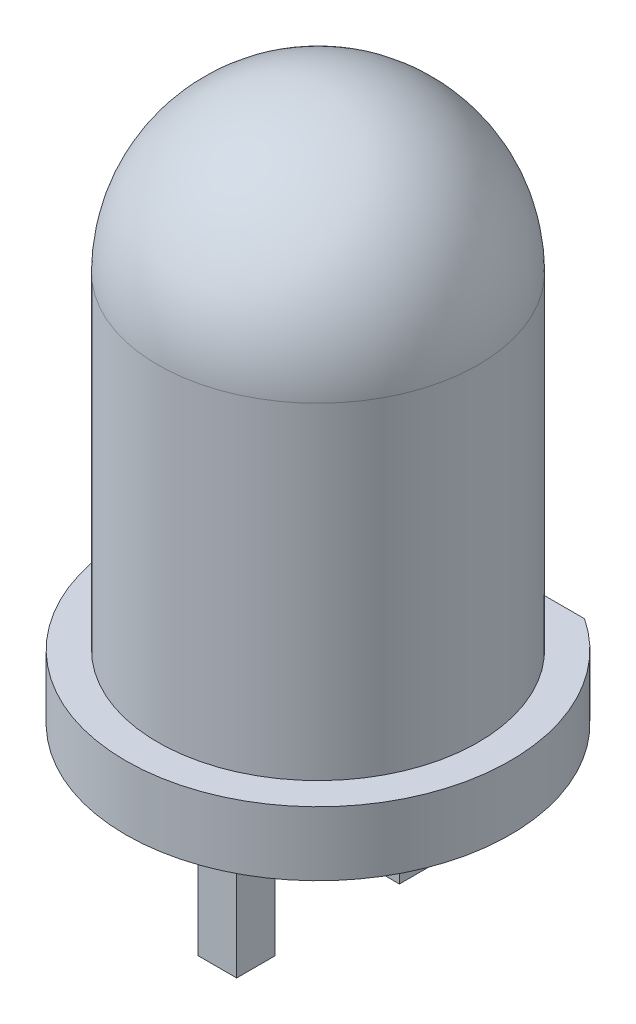
ISO-10303-21;
HEADER;
FILE_DESCRIPTION(('STEP AP214'),'2;1');
FILE_NAME('part.step','',(''),(''),'','','');
FILE_SCHEMA(('AUTOMOTIVE_DESIGN { 1 0 10303 214 1 1 1 1 }'));
ENDSEC;
DATA;
#1=APPLICATION_CONTEXT('core data for automotive mechanical design processes');
#2=APPLICATION_PROTOCOL_DEFINITION('international standard','automotive_design',2000,#1);
#3=PRODUCT_CONTEXT('',#1,'mechanical');
#4=PRODUCT('Part','Part','',(#3));
#5=PRODUCT_RELATED_PRODUCT_CATEGORY('part','',(#4));
#6=PRODUCT_DEFINITION_FORMATION('','',#4);
#7=PRODUCT_DEFINITION_CONTEXT('part definition',#1,'design');
#8=PRODUCT_DEFINITION('design','',#6,#7);
#9=PRODUCT_DEFINITION_SHAPE('','',#8);
#10=(LENGTH_UNIT() NAMED_UNIT(*) SI_UNIT(.MILLI.,.METRE.));
#11=(NAMED_UNIT(*) PLANE_ANGLE_UNIT() SI_UNIT($,.RADIAN.));
#12=(NAMED_UNIT(*) SI_UNIT($,.STERADIAN.) SOLID_ANGLE_UNIT());
#13=UNCERTAINTY_MEASURE_WITH_UNIT(LENGTH_MEASURE(1.E-05),#10,'distance_accuracy_value','');
#14=(GEOMETRIC_REPRESENTATION_CONTEXT(3) GLOBAL_UNCERTAINTY_ASSIGNED_CONTEXT((#13)) GLOBAL_UNIT_ASSIGNED_CONTEXT((#10,
#11,#12)) REPRESENTATION_CONTEXT('',''));
#15=CARTESIAN_POINT('',(0.,0.,0.));
#16=DIRECTION('',(0.,0.,1.));
#17=DIRECTION('',(1.,0.,0.));
#18=AXIS2_PLACEMENT_3D('',#15,#16,#17);
#19=CARTESIAN_POINT('',(-0.3,-27.,-1.57));
#20=DIRECTION('',(1.,0.,0.));
#21=DIRECTION('',(0.,0.,-1.));
#22=AXIS2_PLACEMENT_3D('',#19,#20,#21);
#23=PLANE('',#22);
#24=DIRECTION('',(0.,0.,-1.));
#25=VECTOR('',#24,1.);
#26=CARTESIAN_POINT('',(-0.3,-2.49999999999999,-1.57));
#27=LINE('',#26,#25);
#28=CARTESIAN_POINT('',(-0.3,-2.49999999999999,-0.97));
#29=VERTEX_POINT('',#28);
#30=CARTESIAN_POINT('',(-0.3,-2.49999999999999,-1.57));
#31=VERTEX_POINT('',#30);
#32=EDGE_CURVE('E265',#29,#31,#27,.T.);
#33=ORIENTED_EDGE('',*,*,#32,.F.);
#34=DIRECTION('',(0.,1.,0.));
#35=VECTOR('',#34,1.);
#36=CARTESIAN_POINT('',(-0.3,-27.,-0.97));
#37=LINE('',#36,#35);
#38=CARTESIAN_POINT('',(-0.3,0.,-0.97));
#39=VERTEX_POINT('',#38);
#40=EDGE_CURVE('E248',#29,#39,#37,.T.);
#41=ORIENTED_EDGE('',*,*,#40,.T.);
#42=DIRECTION('',(0.,0.,-1.));
#43=VECTOR('',#42,1.);
#44=CARTESIAN_POINT('',(-0.3,0.,-1.57));
#45=LINE('',#44,#43);
#46=CARTESIAN_POINT('',(-0.3,0.,-1.57));
#47=VERTEX_POINT('',#46);
#48=EDGE_CURVE('E267',#39,#47,#45,.T.);
#49=ORIENTED_EDGE('',*,*,#48,.T.);
#50=DIRECTION('',(0.,1.,0.));
#51=VECTOR('',#50,1.);
#52=CARTESIAN_POINT('',(-0.3,-27.,-1.57));
#53=LINE('',#52,#51);
#54=EDGE_CURVE('E244',#31,#47,#53,.T.);
#55=ORIENTED_EDGE('',*,*,#54,.F.);
#56=EDGE_LOOP('',(#33,#41,#49,#55));
#57=FACE_BOUND('',#56,.T.);
#58=ADVANCED_FACE('F35',(#57),#23,.F.);
#59=CARTESIAN_POINT('',(-0.3,-27.,-1.57));
#60=DIRECTION('',(0.,0.,1.));
#61=DIRECTION('',(1.,0.,0.));
#62=AXIS2_PLACEMENT_3D('',#59,#60,#61);
#63=PLANE('',#62);
#64=DIRECTION('',(1.,0.,0.));
#65=VECTOR('',#64,1.);
#66=CARTESIAN_POINT('',(-0.3,-2.49999999999999,-1.57));
#67=LINE('',#66,#65);
#68=CARTESIAN_POINT('',(0.3,-2.49999999999999,-1.57));
#69=VERTEX_POINT('',#68);
#70=EDGE_CURVE('E237',#31,#69,#67,.T.);
#71=ORIENTED_EDGE('',*,*,#70,.F.);
#72=ORIENTED_EDGE('',*,*,#54,.T.);
#73=DIRECTION('',(1.,0.,0.));
#74=VECTOR('',#73,1.);
#75=CARTESIAN_POINT('',(-0.3,0.,-1.57));
#76=LINE('',#75,#74);
#77=CARTESIAN_POINT('',(0.3,0.,-1.57));
#78=VERTEX_POINT('',#77);
#79=EDGE_CURVE('E242',#47,#78,#76,.T.);
#80=ORIENTED_EDGE('',*,*,#79,.T.);
#81=DIRECTION('',(0.,1.,0.));
#82=VECTOR('',#81,1.);
#83=CARTESIAN_POINT('',(0.3,-27.,-1.57));
#84=LINE('',#83,#82);
#85=EDGE_CURVE('E234',#69,#78,#84,.T.);
#86=ORIENTED_EDGE('',*,*,#85,.F.);
#87=EDGE_LOOP('',(#71,#72,#80,#86));
#88=FACE_BOUND('',#87,.T.);
#89=ADVANCED_FACE('F190',(#88),#63,.F.);
#90=CARTESIAN_POINT('',(0.3,-27.,-1.57));
#91=DIRECTION('',(-1.,0.,0.));
#92=DIRECTION('',(0.,0.,1.));
#93=AXIS2_PLACEMENT_3D('',#90,#91,#92);
#94=PLANE('',#93);
#95=DIRECTION('',(0.,0.,1.));
#96=VECTOR('',#95,1.);
#97=CARTESIAN_POINT('',(0.3,-2.49999999999999,-1.57));
#98=LINE('',#97,#96);
#99=CARTESIAN_POINT('',(0.3,-2.49999999999999,-0.97));
#100=VERTEX_POINT('',#99);
#101=EDGE_CURVE('E50',#69,#100,#98,.T.);
#102=ORIENTED_EDGE('',*,*,#101,.F.);
#103=ORIENTED_EDGE('',*,*,#85,.T.);
#104=DIRECTION('',(0.,0.,1.));
#105=VECTOR('',#104,1.);
#106=CARTESIAN_POINT('',(0.3,0.,-1.57));
#107=LINE('',#106,#105);
#108=CARTESIAN_POINT('',(0.3,0.,-0.97));
#109=VERTEX_POINT('',#108);
#110=EDGE_CURVE('E271',#78,#109,#107,.T.);
#111=ORIENTED_EDGE('',*,*,#110,.T.);
#112=DIRECTION('',(0.,1.,0.));
#113=VECTOR('',#112,1.);
#114=CARTESIAN_POINT('',(0.3,-27.,-0.97));
#115=LINE('',#114,#113);
#116=EDGE_CURVE('E236',#100,#109,#115,.T.);
#117=ORIENTED_EDGE('',*,*,#116,.F.);
#118=EDGE_LOOP('',(#102,#103,#111,#117));
#119=FACE_BOUND('',#118,.T.);
#120=ADVANCED_FACE('F196',(#119),#94,.F.);
#121=CARTESIAN_POINT('',(-0.3,-27.,-0.97));
#122=DIRECTION('',(0.,0.,-1.));
#123=DIRECTION('',(-1.,0.,0.));
#124=AXIS2_PLACEMENT_3D('',#121,#122,#123);
#125=PLANE('',#124);
#126=DIRECTION('',(-1.,0.,0.));
#127=VECTOR('',#126,1.);
#128=CARTESIAN_POINT('',(-0.3,-2.49999999999999,-0.97));
#129=LINE('',#128,#127);
#130=EDGE_CURVE('E125',#100,#29,#129,.T.);
#131=ORIENTED_EDGE('',*,*,#130,.F.);
#132=ORIENTED_EDGE('',*,*,#116,.T.);
#133=DIRECTION('',(-1.,0.,0.));
#134=VECTOR('',#133,1.);
#135=CARTESIAN_POINT('',(-0.3,0.,-0.97));
#136=LINE('',#135,#134);
#137=EDGE_CURVE('E273',#109,#39,#136,.T.);
#138=ORIENTED_EDGE('',*,*,#137,.T.);
#139=ORIENTED_EDGE('',*,*,#40,.F.);
#140=EDGE_LOOP('',(#131,#132,#138,#139));
#141=FACE_BOUND('',#140,.T.);
#142=ADVANCED_FACE('F214',(#141),#125,.F.);
#143=CARTESIAN_POINT('',(0.3,-27.,1.57));
#144=DIRECTION('',(-1.,0.,0.));
#145=DIRECTION('',(0.,0.,1.));
#146=AXIS2_PLACEMENT_3D('',#143,#144,#145);
#147=PLANE('',#146);
#148=DIRECTION('',(0.,0.,1.));
#149=VECTOR('',#148,1.);
#150=CARTESIAN_POINT('',(0.3,-2.49999999999999,1.57));
#151=LINE('',#150,#149);
#152=CARTESIAN_POINT('',(0.3,-2.49999999999999,0.97));
#153=VERTEX_POINT('',#152);
#154=CARTESIAN_POINT('',(0.3,-2.49999999999999,1.57));
#155=VERTEX_POINT('',#154);
#156=EDGE_CURVE('E113',#153,#155,#151,.T.);
#157=ORIENTED_EDGE('',*,*,#156,.F.);
#158=DIRECTION('',(0.,1.,0.));
#159=VECTOR('',#158,1.);
#160=CARTESIAN_POINT('',(0.3,-27.,0.97));
#161=LINE('',#160,#159);
#162=CARTESIAN_POINT('',(0.3,0.,0.97));
#163=VERTEX_POINT('',#162);
#164=EDGE_CURVE('E122',#153,#163,#161,.T.);
#165=ORIENTED_EDGE('',*,*,#164,.T.);
#166=DIRECTION('',(0.,0.,1.));
#167=VECTOR('',#166,1.);
#168=CARTESIAN_POINT('',(0.3,0.,1.57));
#169=LINE('',#168,#167);
#170=CARTESIAN_POINT('',(0.3,0.,1.57));
#171=VERTEX_POINT('',#170);
#172=EDGE_CURVE('E246',#163,#171,#169,.T.);
#173=ORIENTED_EDGE('',*,*,#172,.T.);
#174=DIRECTION('',(0.,1.,0.));
#175=VECTOR('',#174,1.);
#176=CARTESIAN_POINT('',(0.3,-27.,1.57));
#177=LINE('',#176,#175);
#178=EDGE_CURVE('E124',#155,#171,#177,.T.);
#179=ORIENTED_EDGE('',*,*,#178,.F.);
#180=EDGE_LOOP('',(#157,#165,#173,#179));
#181=FACE_BOUND('',#180,.T.);
#182=ADVANCED_FACE('F120',(#181),#147,.F.);
#183=CARTESIAN_POINT('',(-0.3,-27.,1.57));
#184=DIRECTION('',(0.,0.,-1.));
#185=DIRECTION('',(-1.,0.,0.));
#186=AXIS2_PLACEMENT_3D('',#183,#184,#185);
#187=PLANE('',#186);
#188=DIRECTION('',(-1.,0.,0.));
#189=VECTOR('',#188,1.);
#190=CARTESIAN_POINT('',(-0.3,-2.49999999999999,1.57));
#191=LINE('',#190,#189);
#192=CARTESIAN_POINT('',(-0.3,-2.49999999999999,1.57));
#193=VERTEX_POINT('',#192);
#194=EDGE_CURVE('E126',#155,#193,#191,.T.);
#195=ORIENTED_EDGE('',*,*,#194,.F.);
#196=ORIENTED_EDGE('',*,*,#178,.T.);
#197=DIRECTION('',(-1.,0.,0.));
#198=VECTOR('',#197,1.);
#199=CARTESIAN_POINT('',(-0.3,0.,1.57));
#200=LINE('',#199,#198);
#201=CARTESIAN_POINT('',(-0.3,0.,1.57));
#202=VERTEX_POINT('',#201);
#203=EDGE_CURVE('E253',#171,#202,#200,.T.);
#204=ORIENTED_EDGE('',*,*,#203,.T.);
#205=DIRECTION('',(0.,1.,0.));
#206=VECTOR('',#205,1.);
#207=CARTESIAN_POINT('',(-0.3,-27.,1.57));
#208=LINE('',#207,#206);
#209=EDGE_CURVE('E134',#193,#202,#208,.T.);
#210=ORIENTED_EDGE('',*,*,#209,.F.);
#211=EDGE_LOOP('',(#195,#196,#204,#210));
#212=FACE_BOUND('',#211,.T.);
#213=ADVANCED_FACE('F207',(#212),#187,.F.);
#214=CARTESIAN_POINT('',(-0.3,-27.,1.57));
#215=DIRECTION('',(1.,0.,0.));
#216=DIRECTION('',(0.,0.,-1.));
#217=AXIS2_PLACEMENT_3D('',#214,#215,#216);
#218=PLANE('',#217);
#219=DIRECTION('',(0.,0.,-1.));
#220=VECTOR('',#219,1.);
#221=CARTESIAN_POINT('',(-0.3,-2.49999999999999,1.57));
#222=LINE('',#221,#220);
#223=CARTESIAN_POINT('',(-0.3,-2.49999999999999,0.97));
#224=VERTEX_POINT('',#223);
#225=EDGE_CURVE('E57',#193,#224,#222,.T.);
#226=ORIENTED_EDGE('',*,*,#225,.F.);
#227=ORIENTED_EDGE('',*,*,#209,.T.);
#228=DIRECTION('',(0.,0.,-1.));
#229=VECTOR('',#228,1.);
#230=CARTESIAN_POINT('',(-0.3,0.,1.57));
#231=LINE('',#230,#229);
#232=CARTESIAN_POINT('',(-0.3,0.,0.97));
#233=VERTEX_POINT('',#232);
#234=EDGE_CURVE('E136',#202,#233,#231,.T.);
#235=ORIENTED_EDGE('',*,*,#234,.T.);
#236=DIRECTION('',(0.,1.,0.));
#237=VECTOR('',#236,1.);
#238=CARTESIAN_POINT('',(-0.3,-27.,0.97));
#239=LINE('',#238,#237);
#240=EDGE_CURVE('E132',#224,#233,#239,.T.);
#241=ORIENTED_EDGE('',*,*,#240,.F.);
#242=EDGE_LOOP('',(#226,#227,#235,#241));
#243=FACE_BOUND('',#242,.T.);
#244=ADVANCED_FACE('F204',(#243),#218,.F.);
#245=CARTESIAN_POINT('',(-0.3,-27.,0.97));
#246=DIRECTION('',(0.,0.,1.));
#247=DIRECTION('',(1.,0.,0.));
#248=AXIS2_PLACEMENT_3D('',#245,#246,#247);
#249=PLANE('',#248);
#250=DIRECTION('',(1.,0.,0.));
#251=VECTOR('',#250,1.);
#252=CARTESIAN_POINT('',(-0.3,-2.49999999999999,0.97));
#253=LINE('',#252,#251);
#254=EDGE_CURVE('E11',#224,#153,#253,.T.);
#255=ORIENTED_EDGE('',*,*,#254,.F.);
#256=ORIENTED_EDGE('',*,*,#240,.T.);
#257=DIRECTION('',(1.,0.,0.));
#258=VECTOR('',#257,1.);
#259=CARTESIAN_POINT('',(-0.3,0.,0.97));
#260=LINE('',#259,#258);
#261=EDGE_CURVE('E130',#233,#163,#260,.T.);
#262=ORIENTED_EDGE('',*,*,#261,.T.);
#263=ORIENTED_EDGE('',*,*,#164,.F.);
#264=EDGE_LOOP('',(#255,#256,#262,#263));
#265=FACE_BOUND('',#264,.T.);
#266=ADVANCED_FACE('F128',(#265),#249,.F.);
#267=CARTESIAN_POINT('',(0.,0.,0.));
#268=DIRECTION('',(0.,-1.,0.));
#269=DIRECTION('',(0.,0.,-1.));
#270=AXIS2_PLACEMENT_3D('',#267,#268,#269);
#271=PLANE('',#270);
#272=ORIENTED_EDGE('',*,*,#203,.F.);
#273=ORIENTED_EDGE('',*,*,#172,.F.);
#274=ORIENTED_EDGE('',*,*,#261,.F.);
#275=ORIENTED_EDGE('',*,*,#234,.F.);
#276=EDGE_LOOP('',(#272,#273,#274,#275));
#277=FACE_BOUND('',#276,.T.);
#278=CARTESIAN_POINT('',(0.,0.,0.));
#279=DIRECTION('',(0.,-1.,0.));
#280=DIRECTION('',(0.,0.,-1.));
#281=AXIS2_PLACEMENT_3D('',#278,#279,#280);
#282=CIRCLE('',#281,3.);
#283=CARTESIAN_POINT('',(1.6583123951777,0.,-2.5));
#284=VERTEX_POINT('',#283);
#285=CARTESIAN_POINT('',(-1.6583123951777,0.,-2.5));
#286=VERTEX_POINT('',#285);
#287=EDGE_CURVE('E43',#284,#286,#282,.T.);
#288=ORIENTED_EDGE('',*,*,#287,.T.);
#289=DIRECTION('',(1.,0.,0.));
#290=VECTOR('',#289,1.);
#291=CARTESIAN_POINT('',(-3.62631175056549,0.,-2.5));
#292=LINE('',#291,#290);
#293=EDGE_CURVE('E142',#286,#284,#292,.T.);
#294=ORIENTED_EDGE('',*,*,#293,.T.);
#295=EDGE_LOOP('',(#288,#294));
#296=FACE_BOUND('',#295,.T.);
#297=ORIENTED_EDGE('',*,*,#79,.F.);
#298=ORIENTED_EDGE('',*,*,#48,.F.);
#299=ORIENTED_EDGE('',*,*,#137,.F.);
#300=ORIENTED_EDGE('',*,*,#110,.F.);
#301=EDGE_LOOP('',(#297,#298,#299,#300));
#302=FACE_BOUND('',#301,.T.);
#303=ADVANCED_FACE('F37',(#277,#296,#302),#271,.T.);
#304=CARTESIAN_POINT('',(0.,0.,0.));
#305=DIRECTION('',(0.,-1.,0.));
#306=DIRECTION('',(0.,0.,-1.));
#307=AXIS2_PLACEMENT_3D('',#304,#305,#306);
#308=CYLINDRICAL_SURFACE('',#307,3.);
#309=ORIENTED_EDGE('',*,*,#287,.F.);
#310=DIRECTION('',(0.,-1.,0.));
#311=VECTOR('',#310,1.);
#312=CARTESIAN_POINT('',(1.6583123951777,0.,-2.5));
#313=LINE('',#312,#311);
#314=CARTESIAN_POINT('',(1.6583123951777,1.,-2.5));
#315=VERTEX_POINT('',#314);
#316=EDGE_CURVE('E151',#284,#315,#313,.F.);
#317=ORIENTED_EDGE('',*,*,#316,.T.);
#318=CARTESIAN_POINT('',(0.,1.,0.));
#319=DIRECTION('',(0.,-1.,0.));
#320=DIRECTION('',(0.,0.,-1.));
#321=AXIS2_PLACEMENT_3D('',#318,#319,#320);
#322=CIRCLE('',#321,3.);
#323=CARTESIAN_POINT('',(-1.6583123951777,1.,-2.5));
#324=VERTEX_POINT('',#323);
#325=EDGE_CURVE('E160',#315,#324,#322,.T.);
#326=ORIENTED_EDGE('',*,*,#325,.T.);
#327=DIRECTION('',(0.,-1.,0.));
#328=VECTOR('',#327,1.);
#329=CARTESIAN_POINT('',(-1.6583123951777,0.,-2.5));
#330=LINE('',#329,#328);
#331=EDGE_CURVE('E148',#324,#286,#330,.T.);
#332=ORIENTED_EDGE('',*,*,#331,.T.);
#333=EDGE_LOOP('',(#309,#317,#326,#332));
#334=FACE_BOUND('',#333,.T.);
#335=ADVANCED_FACE('F167',(#334),#308,.T.);
#336=CARTESIAN_POINT('',(0.,1.,-2.5));
#337=DIRECTION('',(0.,1.,0.));
#338=DIRECTION('',(0.,0.,1.));
#339=AXIS2_PLACEMENT_3D('',#336,#337,#338);
#340=PLANE('',#339);
#341=ORIENTED_EDGE('',*,*,#325,.F.);
#342=DIRECTION('',(1.,0.,0.));
#343=VECTOR('',#342,1.);
#344=CARTESIAN_POINT('',(-3.62631175056549,1.,-2.5));
#345=LINE('',#344,#343);
#346=CARTESIAN_POINT('',(0.,1.,-2.5));
#347=VERTEX_POINT('',#346);
#348=EDGE_CURVE('E145',#347,#315,#345,.T.);
#349=ORIENTED_EDGE('',*,*,#348,.F.);
#350=CARTESIAN_POINT('',(0.,1.,0.));
#351=DIRECTION('',(0.,-1.,0.));
#352=DIRECTION('',(0.,0.,-1.));
#353=AXIS2_PLACEMENT_3D('',#350,#351,#352);
#354=CIRCLE('',#353,2.5);
#355=EDGE_CURVE('E157',#347,#347,#354,.T.);
#356=ORIENTED_EDGE('',*,*,#355,.T.);
#357=EDGE_CURVE('E147',#324,#347,#345,.T.);
#358=ORIENTED_EDGE('',*,*,#357,.F.);
#359=EDGE_LOOP('',(#341,#349,#356,#358));
#360=FACE_BOUND('',#359,.T.);
#361=ADVANCED_FACE('F174',(#360),#340,.T.);
#362=CARTESIAN_POINT('',(0.,0.,0.));
#363=DIRECTION('',(0.,-1.,0.));
#364=DIRECTION('',(0.,0.,-1.));
#365=AXIS2_PLACEMENT_3D('',#362,#363,#364);
#366=CYLINDRICAL_SURFACE('',#365,2.5);
#367=CARTESIAN_POINT('',(0.,6.1,0.));
#368=DIRECTION('',(0.,-1.,0.));
#369=DIRECTION('',(0.,0.,-1.));
#370=AXIS2_PLACEMENT_3D('',#367,#368,#369);
#371=CIRCLE('',#370,2.5);
#372=CARTESIAN_POINT('',(0.,6.1,-2.5));
#373=VERTEX_POINT('',#372);
#374=EDGE_CURVE('E154',#373,#373,#371,.T.);
#375=ORIENTED_EDGE('',*,*,#374,.T.);
#376=EDGE_LOOP('',(#375));
#377=FACE_BOUND('',#376,.T.);
#378=ORIENTED_EDGE('',*,*,#355,.F.);
#379=EDGE_LOOP('',(#378));
#380=FACE_BOUND('',#379,.T.);
#381=ADVANCED_FACE('F177',(#377,#380),#366,.T.);
#382=CARTESIAN_POINT('',(0.,6.1,0.));
#383=DIRECTION('',(0.,-1.,0.));
#384=DIRECTION('',(0.,0.,-1.));
#385=AXIS2_PLACEMENT_3D('',#382,#383,#384);
#386=SPHERICAL_SURFACE('',#385,2.5);
#387=ORIENTED_EDGE('',*,*,#374,.F.);
#388=EDGE_LOOP('',(#387));
#389=FACE_BOUND('',#388,.T.);
#390=ADVANCED_FACE('F179',(#389),#386,.T.);
#391=CARTESIAN_POINT('',(-3.62631175056549,8.29140445271396,-2.5));
#392=DIRECTION('',(0.,0.,-1.));
#393=DIRECTION('',(-1.,0.,0.));
#394=AXIS2_PLACEMENT_3D('',#391,#392,#393);
#395=PLANE('',#394);
#396=ORIENTED_EDGE('',*,*,#293,.F.);
#397=ORIENTED_EDGE('',*,*,#331,.F.);
#398=ORIENTED_EDGE('',*,*,#357,.T.);
#399=ORIENTED_EDGE('',*,*,#348,.T.);
#400=ORIENTED_EDGE('',*,*,#316,.F.);
#401=EDGE_LOOP('',(#396,#397,#398,#399,#400));
#402=FACE_BOUND('',#401,.T.);
#403=ADVANCED_FACE('F171',(#402),#395,.T.);
#404=CARTESIAN_POINT('',(0.,-2.49999999999999,0.));
#405=DIRECTION('',(0.,-1.,0.));
#406=DIRECTION('',(0.,0.,-1.));
#407=AXIS2_PLACEMENT_3D('',#404,#405,#406);
#408=PLANE('',#407);
#409=ORIENTED_EDGE('',*,*,#156,.T.);
#410=ORIENTED_EDGE('',*,*,#194,.T.);
#411=ORIENTED_EDGE('',*,*,#225,.T.);
#412=ORIENTED_EDGE('',*,*,#254,.T.);
#413=EDGE_LOOP('',(#409,#410,#411,#412));
#414=FACE_BOUND('',#413,.T.);
#415=ADVANCED_FACE('F112',(#414),#408,.T.);
#416=ORIENTED_EDGE('',*,*,#32,.T.);
#417=ORIENTED_EDGE('',*,*,#70,.T.);
#418=ORIENTED_EDGE('',*,*,#101,.T.);
#419=ORIENTED_EDGE('',*,*,#130,.T.);
#420=EDGE_LOOP('',(#416,#417,#418,#419));
#421=FACE_BOUND('',#420,.T.);
#422=ADVANCED_FACE('F219',(#421),#408,.T.);
#423=CLOSED_SHELL('',(#58,#89,#120,#142,#182,#213,#244,#266,#303,#335,#361,#381,#390,#403,#415,#422));
#424=MANIFOLD_SOLID_BREP('B2',#423);
#425=ADVANCED_BREP_SHAPE_REPRESENTATION('',(#18,#424),#14);
#426=SHAPE_DEFINITION_REPRESENTATION(#9,#425);
ENDSEC;
END-ISO-10303-21;
